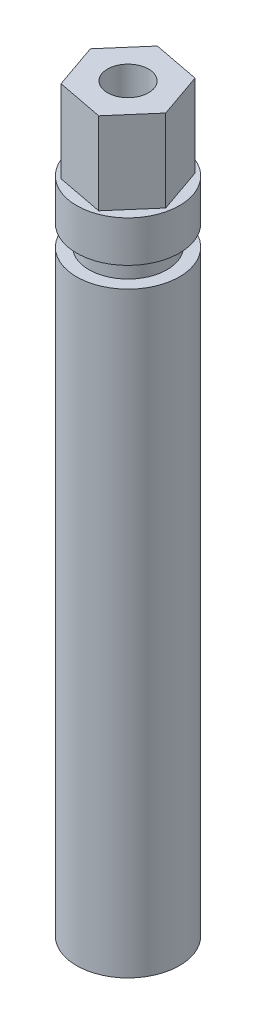
ISO-10303-21;
HEADER;
FILE_DESCRIPTION(('STEP AP214'),'2;1');
FILE_NAME('part.step','',(''),(''),'','','');
FILE_SCHEMA(('AUTOMOTIVE_DESIGN { 1 0 10303 214 1 1 1 1 }'));
ENDSEC;
DATA;
#1=APPLICATION_CONTEXT('core data for automotive mechanical design processes');
#2=APPLICATION_PROTOCOL_DEFINITION('international standard','automotive_design',2000,#1);
#3=PRODUCT_CONTEXT('',#1,'mechanical');
#4=PRODUCT('Part','Part','',(#3));
#5=PRODUCT_RELATED_PRODUCT_CATEGORY('part','',(#4));
#6=PRODUCT_DEFINITION_FORMATION('','',#4);
#7=PRODUCT_DEFINITION_CONTEXT('part definition',#1,'design');
#8=PRODUCT_DEFINITION('design','',#6,#7);
#9=PRODUCT_DEFINITION_SHAPE('','',#8);
#10=(LENGTH_UNIT() NAMED_UNIT(*) SI_UNIT(.MILLI.,.METRE.));
#11=(NAMED_UNIT(*) PLANE_ANGLE_UNIT() SI_UNIT($,.RADIAN.));
#12=(NAMED_UNIT(*) SI_UNIT($,.STERADIAN.) SOLID_ANGLE_UNIT());
#13=UNCERTAINTY_MEASURE_WITH_UNIT(LENGTH_MEASURE(1.E-05),#10,'distance_accuracy_value','');
#14=(GEOMETRIC_REPRESENTATION_CONTEXT(3) GLOBAL_UNCERTAINTY_ASSIGNED_CONTEXT((#13)) GLOBAL_UNIT_ASSIGNED_CONTEXT((#10,
#11,#12)) REPRESENTATION_CONTEXT('',''));
#15=CARTESIAN_POINT('',(0.,0.,0.));
#16=DIRECTION('',(0.,0.,1.));
#17=DIRECTION('',(1.,0.,0.));
#18=AXIS2_PLACEMENT_3D('',#15,#16,#17);
#19=CARTESIAN_POINT('',(0.,215.9,0.));
#20=DIRECTION('',(0.,1.,0.));
#21=DIRECTION('',(0.,0.,1.));
#22=AXIS2_PLACEMENT_3D('',#19,#20,#21);
#23=PLANE('',#22);
#24=CARTESIAN_POINT('',(0.,215.9,0.));
#25=DIRECTION('',(0.,1.,0.));
#26=DIRECTION('',(0.,0.,1.));
#27=AXIS2_PLACEMENT_3D('',#24,#25,#26);
#28=CIRCLE('',#27,6.35);
#29=CARTESIAN_POINT('',(0.,215.9,6.35));
#30=VERTEX_POINT('',#29);
#31=EDGE_CURVE('E11',#30,#30,#28,.T.);
#32=ORIENTED_EDGE('',*,*,#31,.F.);
#33=EDGE_LOOP('',(#32));
#34=FACE_BOUND('',#33,.T.);
#35=DIRECTION('',(0.654115371822532,0.,-0.756394791326243));
#36=VECTOR('',#35,1.);
#37=CARTESIAN_POINT('',(4.81001203760758,215.9,13.8534153742463));
#38=LINE('',#37,#36);
#39=CARTESIAN_POINT('',(4.81001203760758,215.9,13.8534153742463));
#40=VERTEX_POINT('',#39);
#41=CARTESIAN_POINT('',(14.402415662079,215.9,2.76111507004603));
#42=VERTEX_POINT('',#41);
#43=EDGE_CURVE('E111',#40,#42,#38,.T.);
#44=ORIENTED_EDGE('',*,*,#43,.T.);
#45=DIRECTION('',(-0.327999418667489,0.,-0.944677924667338));
#46=VECTOR('',#45,1.);
#47=CARTESIAN_POINT('',(14.402415662079,215.9,2.76111507004603));
#48=LINE('',#47,#46);
#49=CARTESIAN_POINT('',(9.59240362447141,215.9,-11.0923003042003));
#50=VERTEX_POINT('',#49);
#51=EDGE_CURVE('E125',#42,#50,#48,.T.);
#52=ORIENTED_EDGE('',*,*,#51,.T.);
#53=DIRECTION('',(-0.982114790490022,0.,-0.188283133341095));
#54=VECTOR('',#53,1.);
#55=CARTESIAN_POINT('',(9.59240362447141,215.9,-11.0923003042003));
#56=LINE('',#55,#54);
#57=CARTESIAN_POINT('',(-4.81001203760758,215.9,-13.8534153742463));
#58=VERTEX_POINT('',#57);
#59=EDGE_CURVE('E94',#50,#58,#56,.T.);
#60=ORIENTED_EDGE('',*,*,#59,.T.);
#61=DIRECTION('',(-0.654115371822532,0.,0.756394791326243));
#62=VECTOR('',#61,1.);
#63=CARTESIAN_POINT('',(-4.81001203760758,215.9,-13.8534153742463));
#64=LINE('',#63,#62);
#65=CARTESIAN_POINT('',(-14.402415662079,215.9,-2.76111507004602));
#66=VERTEX_POINT('',#65);
#67=EDGE_CURVE('E50',#58,#66,#64,.T.);
#68=ORIENTED_EDGE('',*,*,#67,.T.);
#69=DIRECTION('',(0.327999418667489,0.,0.944677924667338));
#70=VECTOR('',#69,1.);
#71=CARTESIAN_POINT('',(-14.402415662079,215.9,-2.76111507004602));
#72=LINE('',#71,#70);
#73=CARTESIAN_POINT('',(-9.59240362447141,215.9,11.0923003042003));
#74=VERTEX_POINT('',#73);
#75=EDGE_CURVE('E129',#66,#74,#72,.T.);
#76=ORIENTED_EDGE('',*,*,#75,.T.);
#77=DIRECTION('',(0.982114790490022,0.,0.188283133341096));
#78=VECTOR('',#77,1.);
#79=CARTESIAN_POINT('',(-9.59240362447141,215.9,11.0923003042003));
#80=LINE('',#79,#78);
#81=EDGE_CURVE('E114',#74,#40,#80,.T.);
#82=ORIENTED_EDGE('',*,*,#81,.T.);
#83=EDGE_LOOP('',(#44,#52,#60,#68,#76,#82));
#84=FACE_BOUND('',#83,.T.);
#85=ADVANCED_FACE('F35',(#34,#84),#23,.T.);
#86=CARTESIAN_POINT('',(0.,215.9,0.));
#87=DIRECTION('',(0.,-1.,0.));
#88=DIRECTION('',(0.,0.,-1.));
#89=AXIS2_PLACEMENT_3D('',#86,#87,#88);
#90=CYLINDRICAL_SURFACE('',#89,15.875);
#91=CARTESIAN_POINT('',(0.,177.8,0.));
#92=DIRECTION('',(0.,-1.,0.));
#93=DIRECTION('',(0.,0.,-1.));
#94=AXIS2_PLACEMENT_3D('',#91,#92,#93);
#95=CIRCLE('',#94,15.875);
#96=CARTESIAN_POINT('',(0.,177.8,-15.875));
#97=VERTEX_POINT('',#96);
#98=EDGE_CURVE('E145',#97,#97,#95,.T.);
#99=ORIENTED_EDGE('',*,*,#98,.F.);
#100=EDGE_LOOP('',(#99));
#101=FACE_BOUND('',#100,.T.);
#102=CARTESIAN_POINT('',(0.,190.5,0.));
#103=DIRECTION('',(0.,1.,0.));
#104=DIRECTION('',(0.,0.,1.));
#105=AXIS2_PLACEMENT_3D('',#102,#103,#104);
#106=CIRCLE('',#105,15.875);
#107=CARTESIAN_POINT('',(0.,190.5,15.875));
#108=VERTEX_POINT('',#107);
#109=EDGE_CURVE('E135',#108,#108,#106,.T.);
#110=ORIENTED_EDGE('',*,*,#109,.F.);
#111=EDGE_LOOP('',(#110));
#112=FACE_BOUND('',#111,.T.);
#113=ADVANCED_FACE('F37',(#101,#112),#90,.T.);
#114=CARTESIAN_POINT('',(0.,171.45,0.));
#115=DIRECTION('',(0.,-1.,0.));
#116=DIRECTION('',(0.,0.,-1.));
#117=AXIS2_PLACEMENT_3D('',#114,#115,#116);
#118=CIRCLE('',#117,15.875);
#119=CARTESIAN_POINT('',(0.,171.45,-15.875));
#120=VERTEX_POINT('',#119);
#121=EDGE_CURVE('E154',#120,#120,#118,.T.);
#122=ORIENTED_EDGE('',*,*,#121,.T.);
#123=EDGE_LOOP('',(#122));
#124=FACE_BOUND('',#123,.T.);
#125=CARTESIAN_POINT('',(0.,-12.7,0.));
#126=DIRECTION('',(0.,-1.,0.));
#127=DIRECTION('',(0.,0.,-1.));
#128=AXIS2_PLACEMENT_3D('',#125,#126,#127);
#129=CIRCLE('',#128,15.875);
#130=CARTESIAN_POINT('',(0.,-12.7,-15.875));
#131=VERTEX_POINT('',#130);
#132=EDGE_CURVE('E161',#131,#131,#129,.T.);
#133=ORIENTED_EDGE('',*,*,#132,.F.);
#134=EDGE_LOOP('',(#133));
#135=FACE_BOUND('',#134,.T.);
#136=ADVANCED_FACE('F184',(#124,#135),#90,.T.);
#137=CARTESIAN_POINT('',(0.,0.,0.));
#138=DIRECTION('',(0.,1.,0.));
#139=DIRECTION('',(0.,0.,1.));
#140=AXIS2_PLACEMENT_3D('',#137,#138,#139);
#141=PLANE('',#140);
#142=CARTESIAN_POINT('',(0.,0.,0.));
#143=DIRECTION('',(0.,1.,0.));
#144=DIRECTION('',(0.,0.,1.));
#145=AXIS2_PLACEMENT_3D('',#142,#143,#144);
#146=CIRCLE('',#145,6.35);
#147=CARTESIAN_POINT('',(0.,0.,6.35));
#148=VERTEX_POINT('',#147);
#149=EDGE_CURVE('E39',#148,#148,#146,.T.);
#150=ORIENTED_EDGE('',*,*,#149,.T.);
#151=EDGE_LOOP('',(#150));
#152=FACE_BOUND('',#151,.T.);
#153=CARTESIAN_POINT('',(0.,0.,0.));
#154=DIRECTION('',(0.,-1.,0.));
#155=DIRECTION('',(0.,0.,-1.));
#156=AXIS2_PLACEMENT_3D('',#153,#154,#155);
#157=CIRCLE('',#156,12.7);
#158=CARTESIAN_POINT('',(0.,0.,-12.7));
#159=VERTEX_POINT('',#158);
#160=EDGE_CURVE('E157',#159,#159,#157,.T.);
#161=ORIENTED_EDGE('',*,*,#160,.T.);
#162=EDGE_LOOP('',(#161));
#163=FACE_BOUND('',#162,.T.);
#164=ADVANCED_FACE('F170',(#152,#163),#141,.F.);
#165=CARTESIAN_POINT('',(0.,215.9,0.));
#166=DIRECTION('',(0.,-1.,0.));
#167=DIRECTION('',(0.,0.,-1.));
#168=AXIS2_PLACEMENT_3D('',#165,#166,#167);
#169=CYLINDRICAL_SURFACE('',#168,6.35);
#170=ORIENTED_EDGE('',*,*,#31,.T.);
#171=EDGE_LOOP('',(#170));
#172=FACE_BOUND('',#171,.T.);
#173=ORIENTED_EDGE('',*,*,#149,.F.);
#174=EDGE_LOOP('',(#173));
#175=FACE_BOUND('',#174,.T.);
#176=ADVANCED_FACE('F173',(#172,#175),#169,.F.);
#177=CARTESIAN_POINT('',(0.,-12.7,0.));
#178=DIRECTION('',(0.,-1.,0.));
#179=DIRECTION('',(0.,0.,-1.));
#180=AXIS2_PLACEMENT_3D('',#177,#178,#179);
#181=PLANE('',#180);
#182=ORIENTED_EDGE('',*,*,#132,.T.);
#183=EDGE_LOOP('',(#182));
#184=FACE_BOUND('',#183,.T.);
#185=CARTESIAN_POINT('',(0.,-12.7,0.));
#186=DIRECTION('',(0.,-1.,0.));
#187=DIRECTION('',(0.,0.,-1.));
#188=AXIS2_PLACEMENT_3D('',#185,#186,#187);
#189=CIRCLE('',#188,12.7);
#190=CARTESIAN_POINT('',(0.,-12.7,-12.7));
#191=VERTEX_POINT('',#190);
#192=EDGE_CURVE('E158',#191,#191,#189,.T.);
#193=ORIENTED_EDGE('',*,*,#192,.F.);
#194=EDGE_LOOP('',(#193));
#195=FACE_BOUND('',#194,.T.);
#196=ADVANCED_FACE('F175',(#184,#195),#181,.T.);
#197=CARTESIAN_POINT('',(0.,-12.7,0.));
#198=DIRECTION('',(0.,1.,0.));
#199=DIRECTION('',(0.,0.,1.));
#200=AXIS2_PLACEMENT_3D('',#197,#198,#199);
#201=CYLINDRICAL_SURFACE('',#200,12.7);
#202=ORIENTED_EDGE('',*,*,#192,.T.);
#203=EDGE_LOOP('',(#202));
#204=FACE_BOUND('',#203,.T.);
#205=ORIENTED_EDGE('',*,*,#160,.F.);
#206=EDGE_LOOP('',(#205));
#207=FACE_BOUND('',#206,.T.);
#208=ADVANCED_FACE('F182',(#204,#207),#201,.F.);
#209=CARTESIAN_POINT('',(0.,171.45,-15.875));
#210=DIRECTION('',(0.,-1.,0.));
#211=DIRECTION('',(0.,0.,-1.));
#212=AXIS2_PLACEMENT_3D('',#209,#210,#211);
#213=PLANE('',#212);
#214=ORIENTED_EDGE('',*,*,#121,.F.);
#215=EDGE_LOOP('',(#214));
#216=FACE_BOUND('',#215,.T.);
#217=CARTESIAN_POINT('',(0.,171.45,0.));
#218=DIRECTION('',(0.,-1.,0.));
#219=DIRECTION('',(0.,0.,-1.));
#220=AXIS2_PLACEMENT_3D('',#217,#218,#219);
#221=CIRCLE('',#220,12.065);
#222=CARTESIAN_POINT('',(0.,171.45,-12.065));
#223=VERTEX_POINT('',#222);
#224=EDGE_CURVE('E151',#223,#223,#221,.T.);
#225=ORIENTED_EDGE('',*,*,#224,.T.);
#226=EDGE_LOOP('',(#225));
#227=FACE_BOUND('',#226,.T.);
#228=ADVANCED_FACE('F227',(#216,#227),#213,.F.);
#229=CARTESIAN_POINT('',(0.,-12.7,0.));
#230=DIRECTION('',(0.,-1.,0.));
#231=DIRECTION('',(0.,0.,-1.));
#232=AXIS2_PLACEMENT_3D('',#229,#230,#231);
#233=CYLINDRICAL_SURFACE('',#232,12.065);
#234=ORIENTED_EDGE('',*,*,#224,.F.);
#235=EDGE_LOOP('',(#234));
#236=FACE_BOUND('',#235,.T.);
#237=CARTESIAN_POINT('',(0.,177.8,0.));
#238=DIRECTION('',(0.,-1.,0.));
#239=DIRECTION('',(0.,0.,-1.));
#240=AXIS2_PLACEMENT_3D('',#237,#238,#239);
#241=CIRCLE('',#240,12.065);
#242=CARTESIAN_POINT('',(0.,177.8,-12.065));
#243=VERTEX_POINT('',#242);
#244=EDGE_CURVE('E148',#243,#243,#241,.T.);
#245=ORIENTED_EDGE('',*,*,#244,.T.);
#246=EDGE_LOOP('',(#245));
#247=FACE_BOUND('',#246,.T.);
#248=ADVANCED_FACE('F223',(#236,#247),#233,.T.);
#249=CARTESIAN_POINT('',(0.,177.8,-15.875));
#250=DIRECTION('',(0.,1.,0.));
#251=DIRECTION('',(0.,0.,1.));
#252=AXIS2_PLACEMENT_3D('',#249,#250,#251);
#253=PLANE('',#252);
#254=ORIENTED_EDGE('',*,*,#244,.F.);
#255=EDGE_LOOP('',(#254));
#256=FACE_BOUND('',#255,.T.);
#257=ORIENTED_EDGE('',*,*,#98,.T.);
#258=EDGE_LOOP('',(#257));
#259=FACE_BOUND('',#258,.T.);
#260=ADVANCED_FACE('F220',(#256,#259),#253,.F.);
#261=CARTESIAN_POINT('',(0.,190.5,0.));
#262=DIRECTION('',(0.,1.,0.));
#263=DIRECTION('',(0.,0.,1.));
#264=AXIS2_PLACEMENT_3D('',#261,#262,#263);
#265=PLANE('',#264);
#266=DIRECTION('',(0.654115371822532,0.,-0.756394791326243));
#267=VECTOR('',#266,1.);
#268=CARTESIAN_POINT('',(4.81001203760758,190.5,13.8534153742463));
#269=LINE('',#268,#267);
#270=CARTESIAN_POINT('',(4.81001203760758,190.5,13.8534153742463));
#271=VERTEX_POINT('',#270);
#272=CARTESIAN_POINT('',(14.402415662079,190.5,2.76111507004603));
#273=VERTEX_POINT('',#272);
#274=EDGE_CURVE('E100',#271,#273,#269,.T.);
#275=ORIENTED_EDGE('',*,*,#274,.F.);
#276=DIRECTION('',(0.982114790490022,0.,0.188283133341096));
#277=VECTOR('',#276,1.);
#278=CARTESIAN_POINT('',(-9.59240362447141,190.5,11.0923003042003));
#279=LINE('',#278,#277);
#280=CARTESIAN_POINT('',(-9.59240362447141,190.5,11.0923003042003));
#281=VERTEX_POINT('',#280);
#282=EDGE_CURVE('E121',#281,#271,#279,.T.);
#283=ORIENTED_EDGE('',*,*,#282,.F.);
#284=DIRECTION('',(0.327999418667489,0.,0.944677924667338));
#285=VECTOR('',#284,1.);
#286=CARTESIAN_POINT('',(-14.402415662079,190.5,-2.76111507004602));
#287=LINE('',#286,#285);
#288=CARTESIAN_POINT('',(-14.402415662079,190.5,-2.76111507004602));
#289=VERTEX_POINT('',#288);
#290=EDGE_CURVE('E118',#289,#281,#287,.T.);
#291=ORIENTED_EDGE('',*,*,#290,.F.);
#292=DIRECTION('',(-0.654115371822532,0.,0.756394791326243));
#293=VECTOR('',#292,1.);
#294=CARTESIAN_POINT('',(-4.81001203760758,190.5,-13.8534153742463));
#295=LINE('',#294,#293);
#296=CARTESIAN_POINT('',(-4.81001203760758,190.5,-13.8534153742463));
#297=VERTEX_POINT('',#296);
#298=EDGE_CURVE('E58',#297,#289,#295,.T.);
#299=ORIENTED_EDGE('',*,*,#298,.F.);
#300=DIRECTION('',(-0.982114790490022,0.,-0.188283133341095));
#301=VECTOR('',#300,1.);
#302=CARTESIAN_POINT('',(9.59240362447141,190.5,-11.0923003042003));
#303=LINE('',#302,#301);
#304=CARTESIAN_POINT('',(9.59240362447141,190.5,-11.0923003042003));
#305=VERTEX_POINT('',#304);
#306=EDGE_CURVE('E92',#305,#297,#303,.T.);
#307=ORIENTED_EDGE('',*,*,#306,.F.);
#308=DIRECTION('',(-0.327999418667489,0.,-0.944677924667338));
#309=VECTOR('',#308,1.);
#310=CARTESIAN_POINT('',(14.402415662079,190.5,2.76111507004603));
#311=LINE('',#310,#309);
#312=EDGE_CURVE('E106',#273,#305,#311,.T.);
#313=ORIENTED_EDGE('',*,*,#312,.F.);
#314=EDGE_LOOP('',(#275,#283,#291,#299,#307,#313));
#315=FACE_BOUND('',#314,.T.);
#316=ORIENTED_EDGE('',*,*,#109,.T.);
#317=EDGE_LOOP('',(#316));
#318=FACE_BOUND('',#317,.T.);
#319=ADVANCED_FACE('F104',(#315,#318),#265,.T.);
#320=CARTESIAN_POINT('',(14.402415662079,190.5,2.76111507004603));
#321=DIRECTION('',(0.944677924667338,0.,-0.327999418667489));
#322=DIRECTION('',(-0.327999418667489,0.,-0.944677924667338));
#323=AXIS2_PLACEMENT_3D('',#320,#321,#322);
#324=PLANE('',#323);
#325=ORIENTED_EDGE('',*,*,#51,.F.);
#326=DIRECTION('',(0.,1.,0.));
#327=VECTOR('',#326,1.);
#328=CARTESIAN_POINT('',(14.402415662079,190.5,2.76111507004603));
#329=LINE('',#328,#327);
#330=EDGE_CURVE('E110',#273,#42,#329,.T.);
#331=ORIENTED_EDGE('',*,*,#330,.F.);
#332=ORIENTED_EDGE('',*,*,#312,.T.);
#333=DIRECTION('',(0.,1.,0.));
#334=VECTOR('',#333,1.);
#335=CARTESIAN_POINT('',(9.59240362447141,190.5,-11.0923003042003));
#336=LINE('',#335,#334);
#337=EDGE_CURVE('E90',#305,#50,#336,.T.);
#338=ORIENTED_EDGE('',*,*,#337,.T.);
#339=EDGE_LOOP('',(#325,#331,#332,#338));
#340=FACE_BOUND('',#339,.T.);
#341=ADVANCED_FACE('F109',(#340),#324,.T.);
#342=CARTESIAN_POINT('',(4.81001203760758,190.5,13.8534153742463));
#343=DIRECTION('',(0.756394791326243,0.,0.654115371822532));
#344=DIRECTION('',(0.654115371822532,0.,-0.756394791326243));
#345=AXIS2_PLACEMENT_3D('',#342,#343,#344);
#346=PLANE('',#345);
#347=ORIENTED_EDGE('',*,*,#43,.F.);
#348=DIRECTION('',(0.,1.,0.));
#349=VECTOR('',#348,1.);
#350=CARTESIAN_POINT('',(4.81001203760758,190.5,13.8534153742463));
#351=LINE('',#350,#349);
#352=EDGE_CURVE('E136',#271,#40,#351,.T.);
#353=ORIENTED_EDGE('',*,*,#352,.F.);
#354=ORIENTED_EDGE('',*,*,#274,.T.);
#355=ORIENTED_EDGE('',*,*,#330,.T.);
#356=EDGE_LOOP('',(#347,#353,#354,#355));
#357=FACE_BOUND('',#356,.T.);
#358=ADVANCED_FACE('F198',(#357),#346,.T.);
#359=CARTESIAN_POINT('',(-9.59240362447141,190.5,11.0923003042003));
#360=DIRECTION('',(-0.188283133341095,0.,0.982114790490022));
#361=DIRECTION('',(0.982114790490022,0.,0.188283133341096));
#362=AXIS2_PLACEMENT_3D('',#359,#360,#361);
#363=PLANE('',#362);
#364=ORIENTED_EDGE('',*,*,#81,.F.);
#365=DIRECTION('',(0.,1.,0.));
#366=VECTOR('',#365,1.);
#367=CARTESIAN_POINT('',(-9.59240362447141,190.5,11.0923003042003));
#368=LINE('',#367,#366);
#369=EDGE_CURVE('E138',#281,#74,#368,.T.);
#370=ORIENTED_EDGE('',*,*,#369,.F.);
#371=ORIENTED_EDGE('',*,*,#282,.T.);
#372=ORIENTED_EDGE('',*,*,#352,.T.);
#373=EDGE_LOOP('',(#364,#370,#371,#372));
#374=FACE_BOUND('',#373,.T.);
#375=ADVANCED_FACE('F201',(#374),#363,.T.);
#376=CARTESIAN_POINT('',(-14.402415662079,190.5,-2.76111507004602));
#377=DIRECTION('',(-0.944677924667338,0.,0.327999418667489));
#378=DIRECTION('',(0.327999418667489,0.,0.944677924667338));
#379=AXIS2_PLACEMENT_3D('',#376,#377,#378);
#380=PLANE('',#379);
#381=ORIENTED_EDGE('',*,*,#75,.F.);
#382=DIRECTION('',(0.,1.,0.));
#383=VECTOR('',#382,1.);
#384=CARTESIAN_POINT('',(-14.402415662079,190.5,-2.76111507004602));
#385=LINE('',#384,#383);
#386=EDGE_CURVE('E140',#289,#66,#385,.T.);
#387=ORIENTED_EDGE('',*,*,#386,.F.);
#388=ORIENTED_EDGE('',*,*,#290,.T.);
#389=ORIENTED_EDGE('',*,*,#369,.T.);
#390=EDGE_LOOP('',(#381,#387,#388,#389));
#391=FACE_BOUND('',#390,.T.);
#392=ADVANCED_FACE('F204',(#391),#380,.T.);
#393=CARTESIAN_POINT('',(-4.81001203760758,190.5,-13.8534153742463));
#394=DIRECTION('',(-0.756394791326243,0.,-0.654115371822532));
#395=DIRECTION('',(-0.654115371822532,0.,0.756394791326243));
#396=AXIS2_PLACEMENT_3D('',#393,#394,#395);
#397=PLANE('',#396);
#398=ORIENTED_EDGE('',*,*,#67,.F.);
#399=DIRECTION('',(0.,1.,0.));
#400=VECTOR('',#399,1.);
#401=CARTESIAN_POINT('',(-4.81001203760758,190.5,-13.8534153742463));
#402=LINE('',#401,#400);
#403=EDGE_CURVE('E99',#297,#58,#402,.T.);
#404=ORIENTED_EDGE('',*,*,#403,.F.);
#405=ORIENTED_EDGE('',*,*,#298,.T.);
#406=ORIENTED_EDGE('',*,*,#386,.T.);
#407=EDGE_LOOP('',(#398,#404,#405,#406));
#408=FACE_BOUND('',#407,.T.);
#409=ADVANCED_FACE('F205',(#408),#397,.T.);
#410=CARTESIAN_POINT('',(9.59240362447141,190.5,-11.0923003042003));
#411=DIRECTION('',(0.188283133341095,0.,-0.982114790490022));
#412=DIRECTION('',(-0.982114790490022,0.,-0.188283133341095));
#413=AXIS2_PLACEMENT_3D('',#410,#411,#412);
#414=PLANE('',#413);
#415=ORIENTED_EDGE('',*,*,#59,.F.);
#416=ORIENTED_EDGE('',*,*,#337,.F.);
#417=ORIENTED_EDGE('',*,*,#306,.T.);
#418=ORIENTED_EDGE('',*,*,#403,.T.);
#419=EDGE_LOOP('',(#415,#416,#417,#418));
#420=FACE_BOUND('',#419,.T.);
#421=ADVANCED_FACE('F91',(#420),#414,.T.);
#422=CLOSED_SHELL('',(#85,#113,#136,#164,#176,#196,#208,#228,#248,#260,#319,#341,#358,#375,#392,
#409,#421));
#423=MANIFOLD_SOLID_BREP('B2',#422);
#424=ADVANCED_BREP_SHAPE_REPRESENTATION('',(#18,#423),#14);
#425=SHAPE_DEFINITION_REPRESENTATION(#9,#424);
ENDSEC;
END-ISO-10303-21;
